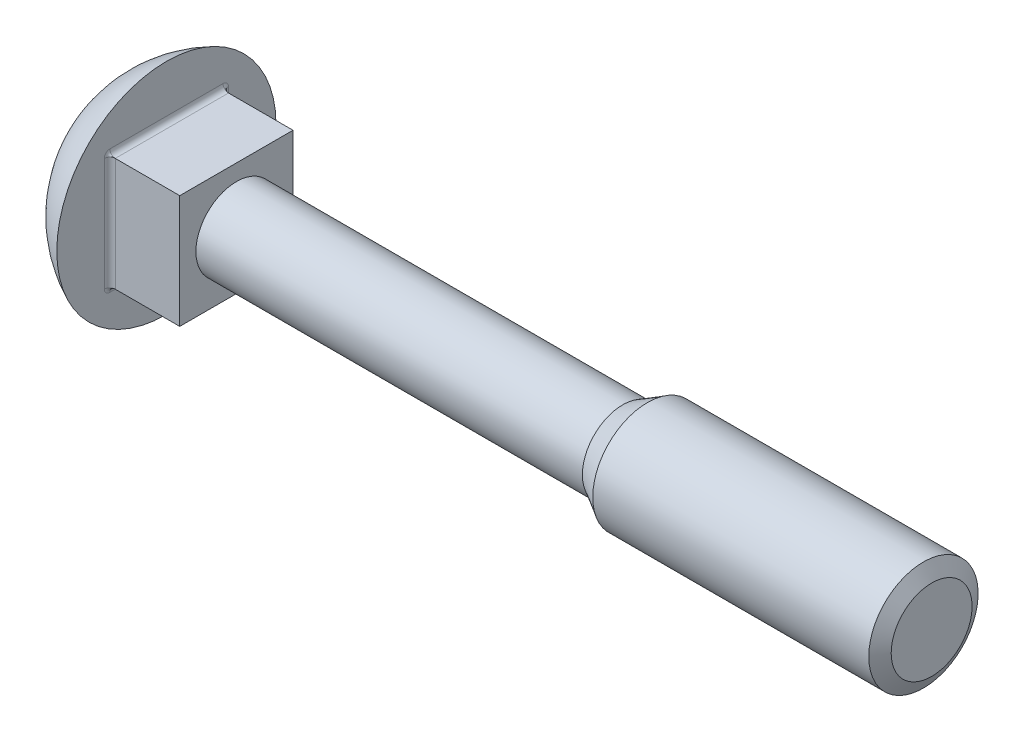
ISO-10303-21;
HEADER;
FILE_DESCRIPTION(('STEP AP214'),'2;1');
FILE_NAME('part.step','',(''),(''),'','','');
FILE_SCHEMA(('AUTOMOTIVE_DESIGN { 1 0 10303 214 1 1 1 1 }'));
ENDSEC;
DATA;
#1=APPLICATION_CONTEXT('core data for automotive mechanical design processes');
#2=APPLICATION_PROTOCOL_DEFINITION('international standard','automotive_design',2000,#1);
#3=PRODUCT_CONTEXT('',#1,'mechanical');
#4=PRODUCT('Part','Part','',(#3));
#5=PRODUCT_RELATED_PRODUCT_CATEGORY('part','',(#4));
#6=PRODUCT_DEFINITION_FORMATION('','',#4);
#7=PRODUCT_DEFINITION_CONTEXT('part definition',#1,'design');
#8=PRODUCT_DEFINITION('design','',#6,#7);
#9=PRODUCT_DEFINITION_SHAPE('','',#8);
#10=(LENGTH_UNIT() NAMED_UNIT(*) SI_UNIT(.MILLI.,.METRE.));
#11=(NAMED_UNIT(*) PLANE_ANGLE_UNIT() SI_UNIT($,.RADIAN.));
#12=(NAMED_UNIT(*) SI_UNIT($,.STERADIAN.) SOLID_ANGLE_UNIT());
#13=UNCERTAINTY_MEASURE_WITH_UNIT(LENGTH_MEASURE(1.E-05),#10,'distance_accuracy_value','');
#14=(GEOMETRIC_REPRESENTATION_CONTEXT(3) GLOBAL_UNCERTAINTY_ASSIGNED_CONTEXT((#13)) GLOBAL_UNIT_ASSIGNED_CONTEXT((#10,
#11,#12)) REPRESENTATION_CONTEXT('',''));
#15=CARTESIAN_POINT('',(0.,0.,0.));
#16=DIRECTION('',(0.,0.,1.));
#17=DIRECTION('',(1.,0.,0.));
#18=AXIS2_PLACEMENT_3D('',#15,#16,#17);
#19=CARTESIAN_POINT('',(0.,0.,0.));
#20=DIRECTION('',(-1.,0.,0.));
#21=DIRECTION('',(0.,0.,1.));
#22=AXIS2_PLACEMENT_3D('',#19,#20,#21);
#23=CYLINDRICAL_SURFACE('',#22,5.);
#24=CARTESIAN_POINT('',(50.48,0.,0.));
#25=DIRECTION('',(-1.,0.,0.));
#26=DIRECTION('',(0.,0.,1.));
#27=AXIS2_PLACEMENT_3D('',#24,#25,#26);
#28=CIRCLE('',#27,5.);
#29=CARTESIAN_POINT('',(50.48,0.,5.));
#30=VERTEX_POINT('',#29);
#31=EDGE_CURVE('E156',#30,#30,#28,.T.);
#32=ORIENTED_EDGE('',*,*,#31,.F.);
#33=EDGE_LOOP('',(#32));
#34=FACE_BOUND('',#33,.T.);
#35=CARTESIAN_POINT('',(75.7300220003227,0.,0.));
#36=DIRECTION('',(-1.,0.,0.));
#37=DIRECTION('',(0.,0.,1.));
#38=AXIS2_PLACEMENT_3D('',#35,#36,#37);
#39=CIRCLE('',#38,5.);
#40=CARTESIAN_POINT('',(75.7300220003227,0.,5.));
#41=VERTEX_POINT('',#40);
#42=EDGE_CURVE('E214',#41,#41,#39,.T.);
#43=ORIENTED_EDGE('',*,*,#42,.T.);
#44=EDGE_LOOP('',(#43));
#45=FACE_BOUND('',#44,.T.);
#46=ADVANCED_FACE('F36',(#34,#45),#23,.T.);
#47=CARTESIAN_POINT('',(12.88,-5.18,5.18));
#48=DIRECTION('',(1.,0.,0.));
#49=DIRECTION('',(0.,0.,-1.));
#50=AXIS2_PLACEMENT_3D('',#47,#48,#49);
#51=PLANE('',#50);
#52=DIRECTION('',(0.,-1.,0.));
#53=VECTOR('',#52,1.);
#54=CARTESIAN_POINT('',(12.88,5.18,5.18));
#55=LINE('',#54,#53);
#56=CARTESIAN_POINT('',(12.88,5.18,5.18));
#57=VERTEX_POINT('',#56);
#58=CARTESIAN_POINT('',(12.88,-5.18,5.18));
#59=VERTEX_POINT('',#58);
#60=EDGE_CURVE('E108',#57,#59,#55,.T.);
#61=ORIENTED_EDGE('',*,*,#60,.T.);
#62=DIRECTION('',(0.,0.,-1.));
#63=VECTOR('',#62,1.);
#64=CARTESIAN_POINT('',(12.88,-5.18,5.18));
#65=LINE('',#64,#63);
#66=CARTESIAN_POINT('',(12.88,-5.18,-5.18));
#67=VERTEX_POINT('',#66);
#68=EDGE_CURVE('E100',#59,#67,#65,.T.);
#69=ORIENTED_EDGE('',*,*,#68,.T.);
#70=DIRECTION('',(0.,1.,0.));
#71=VECTOR('',#70,1.);
#72=CARTESIAN_POINT('',(12.88,5.18,-5.18));
#73=LINE('',#72,#71);
#74=CARTESIAN_POINT('',(12.88,5.18,-5.18));
#75=VERTEX_POINT('',#74);
#76=EDGE_CURVE('E107',#67,#75,#73,.T.);
#77=ORIENTED_EDGE('',*,*,#76,.T.);
#78=DIRECTION('',(0.,0.,1.));
#79=VECTOR('',#78,1.);
#80=CARTESIAN_POINT('',(12.88,5.18,5.18));
#81=LINE('',#80,#79);
#82=EDGE_CURVE('E114',#75,#57,#81,.T.);
#83=ORIENTED_EDGE('',*,*,#82,.T.);
#84=EDGE_LOOP('',(#61,#69,#77,#83));
#85=FACE_BOUND('',#84,.T.);
#86=CARTESIAN_POINT('',(12.88,0.,0.));
#87=DIRECTION('',(-1.,0.,0.));
#88=DIRECTION('',(0.,0.,1.));
#89=AXIS2_PLACEMENT_3D('',#86,#87,#88);
#90=CIRCLE('',#89,3.701);
#91=CARTESIAN_POINT('',(12.88,0.,3.701));
#92=VERTEX_POINT('',#91);
#93=EDGE_CURVE('E211',#92,#92,#90,.T.);
#94=ORIENTED_EDGE('',*,*,#93,.T.);
#95=EDGE_LOOP('',(#94));
#96=FACE_BOUND('',#95,.T.);
#97=ADVANCED_FACE('F111',(#85,#96),#51,.T.);
#98=CARTESIAN_POINT('',(6.48,10.0284395595726,0.));
#99=DIRECTION('',(-1.,0.,0.));
#100=DIRECTION('',(0.,0.,1.));
#101=AXIS2_PLACEMENT_3D('',#98,#99,#100);
#102=PLANE('',#101);
#103=CARTESIAN_POINT('',(6.48,5.18,5.18));
#104=DIRECTION('',(-1.,0.,0.));
#105=DIRECTION('',(0.,0.,1.));
#106=AXIS2_PLACEMENT_3D('',#103,#104,#105);
#107=CIRCLE('',#106,0.5);
#108=CARTESIAN_POINT('',(6.48,5.68,5.18));
#109=VERTEX_POINT('',#108);
#110=CARTESIAN_POINT('',(6.48,5.18,5.68));
#111=VERTEX_POINT('',#110);
#112=EDGE_CURVE('E129',#109,#111,#107,.F.);
#113=ORIENTED_EDGE('',*,*,#112,.F.);
#114=DIRECTION('',(0.,0.,1.));
#115=VECTOR('',#114,1.);
#116=CARTESIAN_POINT('',(6.48,5.68,-5.18));
#117=LINE('',#116,#115);
#118=CARTESIAN_POINT('',(6.48,5.68,-5.18));
#119=VERTEX_POINT('',#118);
#120=EDGE_CURVE('E147',#109,#119,#117,.F.);
#121=ORIENTED_EDGE('',*,*,#120,.T.);
#122=CARTESIAN_POINT('',(6.48,5.18,-5.18));
#123=DIRECTION('',(-1.,0.,0.));
#124=DIRECTION('',(0.,0.,1.));
#125=AXIS2_PLACEMENT_3D('',#122,#123,#124);
#126=CIRCLE('',#125,0.5);
#127=CARTESIAN_POINT('',(6.48,5.18,-5.68));
#128=VERTEX_POINT('',#127);
#129=EDGE_CURVE('E144',#128,#119,#126,.F.);
#130=ORIENTED_EDGE('',*,*,#129,.F.);
#131=DIRECTION('',(0.,1.,0.));
#132=VECTOR('',#131,1.);
#133=CARTESIAN_POINT('',(6.48,-5.18,-5.68));
#134=LINE('',#133,#132);
#135=CARTESIAN_POINT('',(6.48,-5.18,-5.68));
#136=VERTEX_POINT('',#135);
#137=EDGE_CURVE('E142',#128,#136,#134,.F.);
#138=ORIENTED_EDGE('',*,*,#137,.T.);
#139=CARTESIAN_POINT('',(6.48,-5.18,-5.18));
#140=DIRECTION('',(-1.,0.,0.));
#141=DIRECTION('',(0.,0.,1.));
#142=AXIS2_PLACEMENT_3D('',#139,#140,#141);
#143=CIRCLE('',#142,0.5);
#144=CARTESIAN_POINT('',(6.48,-5.68,-5.18));
#145=VERTEX_POINT('',#144);
#146=EDGE_CURVE('E139',#145,#136,#143,.F.);
#147=ORIENTED_EDGE('',*,*,#146,.F.);
#148=DIRECTION('',(0.,0.,-1.));
#149=VECTOR('',#148,1.);
#150=CARTESIAN_POINT('',(6.48,-5.68,5.18));
#151=LINE('',#150,#149);
#152=CARTESIAN_POINT('',(6.48,-5.68,5.18));
#153=VERTEX_POINT('',#152);
#154=EDGE_CURVE('E137',#145,#153,#151,.F.);
#155=ORIENTED_EDGE('',*,*,#154,.T.);
#156=CARTESIAN_POINT('',(6.48,-5.18,5.18));
#157=DIRECTION('',(-1.,0.,0.));
#158=DIRECTION('',(0.,0.,1.));
#159=AXIS2_PLACEMENT_3D('',#156,#157,#158);
#160=CIRCLE('',#159,0.5);
#161=CARTESIAN_POINT('',(6.48,-5.18,5.68));
#162=VERTEX_POINT('',#161);
#163=EDGE_CURVE('E134',#162,#153,#160,.F.);
#164=ORIENTED_EDGE('',*,*,#163,.F.);
#165=DIRECTION('',(0.,-1.,0.));
#166=VECTOR('',#165,1.);
#167=CARTESIAN_POINT('',(6.48,5.18,5.68));
#168=LINE('',#167,#166);
#169=EDGE_CURVE('E132',#162,#111,#168,.F.);
#170=ORIENTED_EDGE('',*,*,#169,.T.);
#171=EDGE_LOOP('',(#113,#121,#130,#138,#147,#155,#164,#170));
#172=FACE_BOUND('',#171,.T.);
#173=CARTESIAN_POINT('',(6.48,0.,0.));
#174=DIRECTION('',(-1.,0.,0.));
#175=DIRECTION('',(0.,0.,1.));
#176=AXIS2_PLACEMENT_3D('',#173,#174,#175);
#177=CIRCLE('',#176,10.0284395595726);
#178=CARTESIAN_POINT('',(6.48,0.,10.0284395595726));
#179=VERTEX_POINT('',#178);
#180=EDGE_CURVE('E118',#179,#179,#177,.T.);
#181=ORIENTED_EDGE('',*,*,#180,.F.);
#182=EDGE_LOOP('',(#181));
#183=FACE_BOUND('',#182,.T.);
#184=ADVANCED_FACE('F183',(#172,#183),#102,.F.);
#185=CARTESIAN_POINT('',(11.,0.,0.));
#186=DIRECTION('',(-1.,0.,0.));
#187=DIRECTION('',(0.,1.,0.));
#188=AXIS2_PLACEMENT_3D('',#185,#186,#187);
#189=SPHERICAL_SURFACE('',#188,11.);
#190=ORIENTED_EDGE('',*,*,#180,.T.);
#191=EDGE_LOOP('',(#190));
#192=FACE_BOUND('',#191,.T.);
#193=ADVANCED_FACE('F377',(#192),#189,.T.);
#194=CARTESIAN_POINT('',(12.88,5.18,5.18));
#195=DIRECTION('',(0.,0.,-1.));
#196=DIRECTION('',(0.,1.,0.));
#197=AXIS2_PLACEMENT_3D('',#194,#195,#196);
#198=PLANE('',#197);
#199=DIRECTION('',(-1.,0.,0.));
#200=VECTOR('',#199,1.);
#201=CARTESIAN_POINT('',(12.88,5.18,5.18));
#202=LINE('',#201,#200);
#203=CARTESIAN_POINT('',(6.98,5.18,5.18));
#204=VERTEX_POINT('',#203);
#205=EDGE_CURVE('E200',#57,#204,#202,.T.);
#206=ORIENTED_EDGE('',*,*,#205,.T.);
#207=DIRECTION('',(0.,-1.,0.));
#208=VECTOR('',#207,1.);
#209=CARTESIAN_POINT('',(6.98,-5.18,5.18));
#210=LINE('',#209,#208);
#211=CARTESIAN_POINT('',(6.98,-5.18,5.18));
#212=VERTEX_POINT('',#211);
#213=EDGE_CURVE('E11',#204,#212,#210,.T.);
#214=ORIENTED_EDGE('',*,*,#213,.T.);
#215=DIRECTION('',(-1.,0.,0.));
#216=VECTOR('',#215,1.);
#217=CARTESIAN_POINT('',(12.88,-5.18,5.18));
#218=LINE('',#217,#216);
#219=EDGE_CURVE('E103',#59,#212,#218,.T.);
#220=ORIENTED_EDGE('',*,*,#219,.F.);
#221=ORIENTED_EDGE('',*,*,#60,.F.);
#222=EDGE_LOOP('',(#206,#214,#220,#221));
#223=FACE_BOUND('',#222,.T.);
#224=ADVANCED_FACE('F117',(#223),#198,.F.);
#225=CARTESIAN_POINT('',(12.88,-5.18,5.18));
#226=DIRECTION('',(0.,1.,0.));
#227=DIRECTION('',(0.,0.,1.));
#228=AXIS2_PLACEMENT_3D('',#225,#226,#227);
#229=PLANE('',#228);
#230=ORIENTED_EDGE('',*,*,#219,.T.);
#231=DIRECTION('',(0.,0.,-1.));
#232=VECTOR('',#231,1.);
#233=CARTESIAN_POINT('',(6.98,-5.18,-5.18));
#234=LINE('',#233,#232);
#235=CARTESIAN_POINT('',(6.98,-5.18,-5.18));
#236=VERTEX_POINT('',#235);
#237=EDGE_CURVE('E45',#212,#236,#234,.T.);
#238=ORIENTED_EDGE('',*,*,#237,.T.);
#239=DIRECTION('',(-1.,0.,0.));
#240=VECTOR('',#239,1.);
#241=CARTESIAN_POINT('',(12.88,-5.18,-5.18));
#242=LINE('',#241,#240);
#243=EDGE_CURVE('E104',#67,#236,#242,.T.);
#244=ORIENTED_EDGE('',*,*,#243,.F.);
#245=ORIENTED_EDGE('',*,*,#68,.F.);
#246=EDGE_LOOP('',(#230,#238,#244,#245));
#247=FACE_BOUND('',#246,.T.);
#248=ADVANCED_FACE('F102',(#247),#229,.F.);
#249=CARTESIAN_POINT('',(12.88,5.18,-5.18));
#250=DIRECTION('',(0.,0.,1.));
#251=DIRECTION('',(0.,-1.,0.));
#252=AXIS2_PLACEMENT_3D('',#249,#250,#251);
#253=PLANE('',#252);
#254=ORIENTED_EDGE('',*,*,#243,.T.);
#255=DIRECTION('',(0.,1.,0.));
#256=VECTOR('',#255,1.);
#257=CARTESIAN_POINT('',(6.98,5.18,-5.18));
#258=LINE('',#257,#256);
#259=CARTESIAN_POINT('',(6.98,5.18,-5.18));
#260=VERTEX_POINT('',#259);
#261=EDGE_CURVE('E150',#236,#260,#258,.T.);
#262=ORIENTED_EDGE('',*,*,#261,.T.);
#263=DIRECTION('',(-1.,0.,0.));
#264=VECTOR('',#263,1.);
#265=CARTESIAN_POINT('',(12.88,5.18,-5.18));
#266=LINE('',#265,#264);
#267=EDGE_CURVE('E123',#75,#260,#266,.T.);
#268=ORIENTED_EDGE('',*,*,#267,.F.);
#269=ORIENTED_EDGE('',*,*,#76,.F.);
#270=EDGE_LOOP('',(#254,#262,#268,#269));
#271=FACE_BOUND('',#270,.T.);
#272=ADVANCED_FACE('F354',(#271),#253,.F.);
#273=CARTESIAN_POINT('',(12.88,5.18,5.18));
#274=DIRECTION('',(0.,-1.,0.));
#275=DIRECTION('',(0.,0.,-1.));
#276=AXIS2_PLACEMENT_3D('',#273,#274,#275);
#277=PLANE('',#276);
#278=ORIENTED_EDGE('',*,*,#267,.T.);
#279=DIRECTION('',(0.,0.,1.));
#280=VECTOR('',#279,1.);
#281=CARTESIAN_POINT('',(6.98,5.18,5.18));
#282=LINE('',#281,#280);
#283=EDGE_CURVE('E121',#260,#204,#282,.T.);
#284=ORIENTED_EDGE('',*,*,#283,.T.);
#285=ORIENTED_EDGE('',*,*,#205,.F.);
#286=ORIENTED_EDGE('',*,*,#82,.F.);
#287=EDGE_LOOP('',(#278,#284,#285,#286));
#288=FACE_BOUND('',#287,.T.);
#289=ADVANCED_FACE('F199',(#288),#277,.F.);
#290=CARTESIAN_POINT('',(6.98,-5.68,5.18));
#291=DIRECTION('',(0.,0.,1.));
#292=DIRECTION('',(1.,0.,0.));
#293=AXIS2_PLACEMENT_3D('',#290,#291,#292);
#294=CYLINDRICAL_SURFACE('',#293,0.5);
#295=CARTESIAN_POINT('',(6.98,-5.68,5.18));
#296=DIRECTION('',(0.,0.,-1.));
#297=DIRECTION('',(-1.,0.,0.));
#298=AXIS2_PLACEMENT_3D('',#295,#296,#297);
#299=CIRCLE('',#298,0.5);
#300=EDGE_CURVE('E169',#153,#212,#299,.T.);
#301=ORIENTED_EDGE('',*,*,#300,.F.);
#302=ORIENTED_EDGE('',*,*,#154,.F.);
#303=CARTESIAN_POINT('',(6.98,-5.68,-5.18));
#304=DIRECTION('',(0.,0.,1.));
#305=DIRECTION('',(1.,0.,0.));
#306=AXIS2_PLACEMENT_3D('',#303,#304,#305);
#307=CIRCLE('',#306,0.5);
#308=EDGE_CURVE('E40',#236,#145,#307,.T.);
#309=ORIENTED_EDGE('',*,*,#308,.F.);
#310=ORIENTED_EDGE('',*,*,#237,.F.);
#311=EDGE_LOOP('',(#301,#302,#309,#310));
#312=FACE_BOUND('',#311,.T.);
#313=ADVANCED_FACE('F38',(#312),#294,.F.);
#314=CARTESIAN_POINT('',(6.98,-5.18,-5.18));
#315=DIRECTION('',(-1.,0.,0.));
#316=DIRECTION('',(0.,0.,1.));
#317=AXIS2_PLACEMENT_3D('',#314,#315,#316);
#318=DEGENERATE_TOROIDAL_SURFACE('',#317,0.5,0.5,.T.);
#319=ORIENTED_EDGE('',*,*,#308,.T.);
#320=ORIENTED_EDGE('',*,*,#146,.T.);
#321=CARTESIAN_POINT('',(6.98,-5.18,-5.68));
#322=DIRECTION('',(0.,1.,0.));
#323=DIRECTION('',(0.,0.,1.));
#324=AXIS2_PLACEMENT_3D('',#321,#322,#323);
#325=CIRCLE('',#324,0.5);
#326=EDGE_CURVE('E167',#236,#136,#325,.F.);
#327=ORIENTED_EDGE('',*,*,#326,.F.);
#328=EDGE_LOOP('',(#319,#320,#327));
#329=FACE_BOUND('',#328,.T.);
#330=ADVANCED_FACE('F178',(#329),#318,.F.);
#331=CARTESIAN_POINT('',(6.98,-5.18,5.18));
#332=DIRECTION('',(-1.,0.,0.));
#333=DIRECTION('',(0.,0.,1.));
#334=AXIS2_PLACEMENT_3D('',#331,#332,#333);
#335=DEGENERATE_TOROIDAL_SURFACE('',#334,0.5,0.5,.T.);
#336=ORIENTED_EDGE('',*,*,#163,.T.);
#337=ORIENTED_EDGE('',*,*,#300,.T.);
#338=CARTESIAN_POINT('',(6.98,-5.18,5.68));
#339=DIRECTION('',(0.,1.,0.));
#340=DIRECTION('',(0.,0.,1.));
#341=AXIS2_PLACEMENT_3D('',#338,#339,#340);
#342=CIRCLE('',#341,0.5);
#343=EDGE_CURVE('E164',#162,#212,#342,.F.);
#344=ORIENTED_EDGE('',*,*,#343,.F.);
#345=EDGE_LOOP('',(#336,#337,#344));
#346=FACE_BOUND('',#345,.T.);
#347=ADVANCED_FACE('F327',(#346),#335,.F.);
#348=CARTESIAN_POINT('',(6.98,5.18,-5.68));
#349=DIRECTION('',(0.,-1.,0.));
#350=DIRECTION('',(0.,0.,-1.));
#351=AXIS2_PLACEMENT_3D('',#348,#349,#350);
#352=CYLINDRICAL_SURFACE('',#351,0.5);
#353=ORIENTED_EDGE('',*,*,#326,.T.);
#354=ORIENTED_EDGE('',*,*,#137,.F.);
#355=CARTESIAN_POINT('',(6.98,5.18,-5.68));
#356=DIRECTION('',(0.,-1.,0.));
#357=DIRECTION('',(0.,0.,-1.));
#358=AXIS2_PLACEMENT_3D('',#355,#356,#357);
#359=CIRCLE('',#358,0.5);
#360=EDGE_CURVE('E161',#260,#128,#359,.T.);
#361=ORIENTED_EDGE('',*,*,#360,.F.);
#362=ORIENTED_EDGE('',*,*,#261,.F.);
#363=EDGE_LOOP('',(#353,#354,#361,#362));
#364=FACE_BOUND('',#363,.T.);
#365=ADVANCED_FACE('F188',(#364),#352,.F.);
#366=CARTESIAN_POINT('',(6.98,5.18,5.68));
#367=DIRECTION('',(0.,1.,0.));
#368=DIRECTION('',(0.,0.,1.));
#369=AXIS2_PLACEMENT_3D('',#366,#367,#368);
#370=CYLINDRICAL_SURFACE('',#369,0.5);
#371=ORIENTED_EDGE('',*,*,#343,.T.);
#372=ORIENTED_EDGE('',*,*,#213,.F.);
#373=CARTESIAN_POINT('',(6.98,5.18,5.68));
#374=DIRECTION('',(0.,-1.,0.));
#375=DIRECTION('',(0.,0.,-1.));
#376=AXIS2_PLACEMENT_3D('',#373,#374,#375);
#377=CIRCLE('',#376,0.5);
#378=EDGE_CURVE('E158',#111,#204,#377,.T.);
#379=ORIENTED_EDGE('',*,*,#378,.F.);
#380=ORIENTED_EDGE('',*,*,#169,.F.);
#381=EDGE_LOOP('',(#371,#372,#379,#380));
#382=FACE_BOUND('',#381,.T.);
#383=ADVANCED_FACE('F311',(#382),#370,.F.);
#384=CARTESIAN_POINT('',(6.98,5.18,-5.18));
#385=DIRECTION('',(-1.,0.,0.));
#386=DIRECTION('',(0.,0.,1.));
#387=AXIS2_PLACEMENT_3D('',#384,#385,#386);
#388=DEGENERATE_TOROIDAL_SURFACE('',#387,0.5,0.5,.T.);
#389=ORIENTED_EDGE('',*,*,#360,.T.);
#390=ORIENTED_EDGE('',*,*,#129,.T.);
#391=CARTESIAN_POINT('',(6.98,5.68,-5.18));
#392=DIRECTION('',(0.,0.,1.));
#393=DIRECTION('',(1.,0.,0.));
#394=AXIS2_PLACEMENT_3D('',#391,#392,#393);
#395=CIRCLE('',#394,0.5);
#396=EDGE_CURVE('E155',#260,#119,#395,.F.);
#397=ORIENTED_EDGE('',*,*,#396,.F.);
#398=EDGE_LOOP('',(#389,#390,#397));
#399=FACE_BOUND('',#398,.T.);
#400=ADVANCED_FACE('F191',(#399),#388,.F.);
#401=CARTESIAN_POINT('',(6.98,5.18,5.18));
#402=DIRECTION('',(-1.,0.,0.));
#403=DIRECTION('',(0.,0.,1.));
#404=AXIS2_PLACEMENT_3D('',#401,#402,#403);
#405=DEGENERATE_TOROIDAL_SURFACE('',#404,0.5,0.5,.T.);
#406=ORIENTED_EDGE('',*,*,#112,.T.);
#407=ORIENTED_EDGE('',*,*,#378,.T.);
#408=CARTESIAN_POINT('',(6.98,5.68,5.18));
#409=DIRECTION('',(0.,0.,-1.));
#410=DIRECTION('',(-1.,0.,0.));
#411=AXIS2_PLACEMENT_3D('',#408,#409,#410);
#412=CIRCLE('',#411,0.5);
#413=EDGE_CURVE('E153',#109,#204,#412,.F.);
#414=ORIENTED_EDGE('',*,*,#413,.F.);
#415=EDGE_LOOP('',(#406,#407,#414));
#416=FACE_BOUND('',#415,.T.);
#417=ADVANCED_FACE('F295',(#416),#405,.F.);
#418=CARTESIAN_POINT('',(6.98,5.68,5.18));
#419=DIRECTION('',(0.,0.,-1.));
#420=DIRECTION('',(-1.,0.,0.));
#421=AXIS2_PLACEMENT_3D('',#418,#419,#420);
#422=CYLINDRICAL_SURFACE('',#421,0.5);
#423=ORIENTED_EDGE('',*,*,#396,.T.);
#424=ORIENTED_EDGE('',*,*,#120,.F.);
#425=ORIENTED_EDGE('',*,*,#413,.T.);
#426=ORIENTED_EDGE('',*,*,#283,.F.);
#427=EDGE_LOOP('',(#423,#424,#425,#426));
#428=FACE_BOUND('',#427,.T.);
#429=ADVANCED_FACE('F195',(#428),#422,.F.);
#430=CARTESIAN_POINT('',(50.48,0.,0.));
#431=DIRECTION('',(1.,0.,0.));
#432=DIRECTION('',(0.,0.,-1.));
#433=AXIS2_PLACEMENT_3D('',#430,#431,#432);
#434=CONICAL_SURFACE('',#433,5.,0.523598775598303);
#435=CARTESIAN_POINT('',(48.2300660009681,0.,0.));
#436=DIRECTION('',(-1.,0.,0.));
#437=DIRECTION('',(0.,0.,1.));
#438=AXIS2_PLACEMENT_3D('',#435,#436,#437);
#439=CIRCLE('',#438,3.701);
#440=CARTESIAN_POINT('',(48.2300660009681,0.,3.701));
#441=VERTEX_POINT('',#440);
#442=EDGE_CURVE('E208',#441,#441,#439,.T.);
#443=ORIENTED_EDGE('',*,*,#442,.F.);
#444=EDGE_LOOP('',(#443));
#445=FACE_BOUND('',#444,.T.);
#446=ORIENTED_EDGE('',*,*,#31,.T.);
#447=EDGE_LOOP('',(#446));
#448=FACE_BOUND('',#447,.T.);
#449=ADVANCED_FACE('F242',(#445,#448),#434,.T.);
#450=CARTESIAN_POINT('',(0.,0.,0.));
#451=DIRECTION('',(-1.,0.,0.));
#452=DIRECTION('',(0.,0.,1.));
#453=AXIS2_PLACEMENT_3D('',#450,#451,#452);
#454=CYLINDRICAL_SURFACE('',#453,3.701);
#455=ORIENTED_EDGE('',*,*,#93,.F.);
#456=EDGE_LOOP('',(#455));
#457=FACE_BOUND('',#456,.T.);
#458=ORIENTED_EDGE('',*,*,#442,.T.);
#459=EDGE_LOOP('',(#458));
#460=FACE_BOUND('',#459,.T.);
#461=ADVANCED_FACE('F230',(#457,#460),#454,.T.);
#462=CARTESIAN_POINT('',(75.7300220003227,0.,0.));
#463=DIRECTION('',(-1.,0.,0.));
#464=DIRECTION('',(0.,0.,1.));
#465=AXIS2_PLACEMENT_3D('',#462,#463,#464);
#466=CONICAL_SURFACE('',#465,5.,1.0471975511966);
#467=CARTESIAN_POINT('',(76.48,0.,0.));
#468=DIRECTION('',(-1.,0.,0.));
#469=DIRECTION('',(0.,0.,1.));
#470=AXIS2_PLACEMENT_3D('',#467,#468,#469);
#471=CIRCLE('',#470,3.701);
#472=CARTESIAN_POINT('',(76.48,0.,3.701));
#473=VERTEX_POINT('',#472);
#474=EDGE_CURVE('E217',#473,#473,#471,.T.);
#475=ORIENTED_EDGE('',*,*,#474,.T.);
#476=EDGE_LOOP('',(#475));
#477=FACE_BOUND('',#476,.T.);
#478=ORIENTED_EDGE('',*,*,#42,.F.);
#479=EDGE_LOOP('',(#478));
#480=FACE_BOUND('',#479,.T.);
#481=ADVANCED_FACE('F221',(#477,#480),#466,.T.);
#482=CARTESIAN_POINT('',(76.48,0.,-5.));
#483=DIRECTION('',(-1.,0.,0.));
#484=DIRECTION('',(0.,0.,1.));
#485=AXIS2_PLACEMENT_3D('',#482,#483,#484);
#486=PLANE('',#485);
#487=ORIENTED_EDGE('',*,*,#474,.F.);
#488=EDGE_LOOP('',(#487));
#489=FACE_BOUND('',#488,.T.);
#490=ADVANCED_FACE('F224',(#489),#486,.F.);
#491=CLOSED_SHELL('',(#46,#97,#184,#193,#224,#248,#272,#289,#313,#330,#347,#365,#383,#400,#417,
#429,#449,#461,#481,#490));
#492=MANIFOLD_SOLID_BREP('B2',#491);
#493=ADVANCED_BREP_SHAPE_REPRESENTATION('',(#18,#492),#14);
#494=SHAPE_DEFINITION_REPRESENTATION(#9,#493);
ENDSEC;
END-ISO-10303-21;
